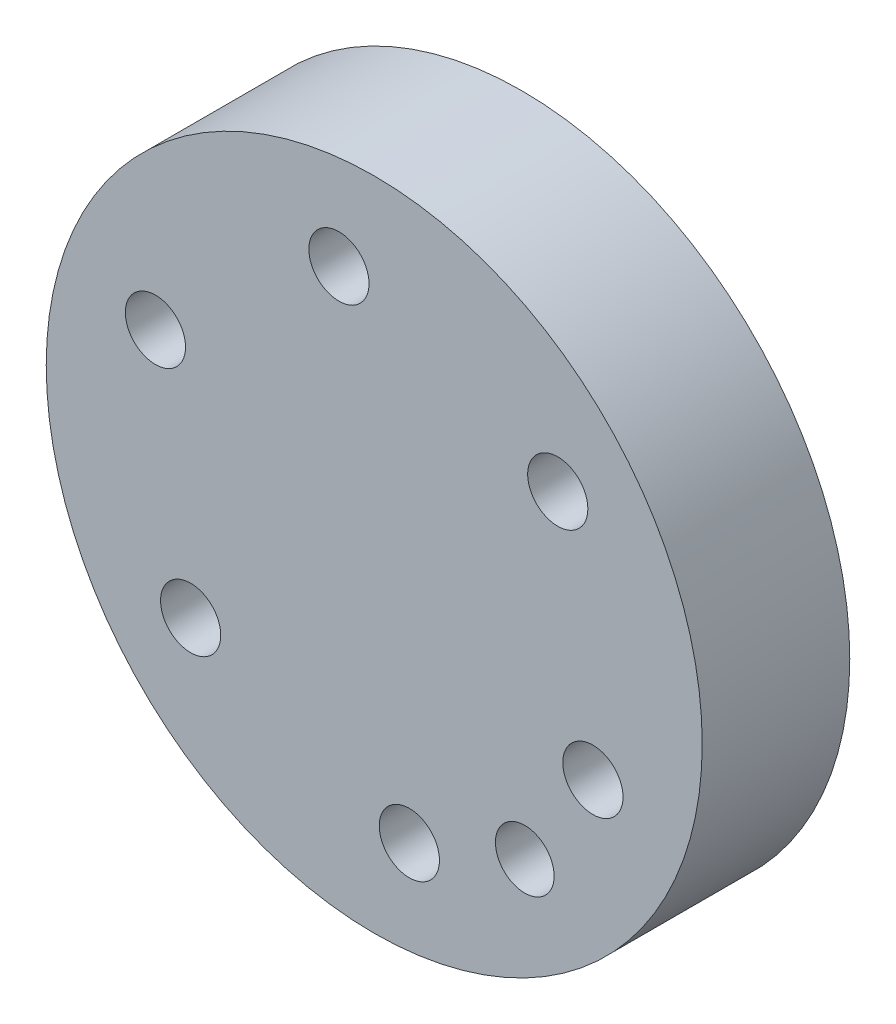
ISO-10303-21;
HEADER;
FILE_DESCRIPTION(('STEP AP214'),'2;1');
FILE_NAME('part.step','',(''),(''),'','','');
FILE_SCHEMA(('AUTOMOTIVE_DESIGN { 1 0 10303 214 1 1 1 1 }'));
ENDSEC;
DATA;
#1=APPLICATION_CONTEXT('core data for automotive mechanical design processes');
#2=APPLICATION_PROTOCOL_DEFINITION('international standard','automotive_design',2000,#1);
#3=PRODUCT_CONTEXT('',#1,'mechanical');
#4=PRODUCT('Part','Part','',(#3));
#5=PRODUCT_RELATED_PRODUCT_CATEGORY('part','',(#4));
#6=PRODUCT_DEFINITION_FORMATION('','',#4);
#7=PRODUCT_DEFINITION_CONTEXT('part definition',#1,'design');
#8=PRODUCT_DEFINITION('design','',#6,#7);
#9=PRODUCT_DEFINITION_SHAPE('','',#8);
#10=(LENGTH_UNIT() NAMED_UNIT(*) SI_UNIT(.MILLI.,.METRE.));
#11=(NAMED_UNIT(*) PLANE_ANGLE_UNIT() SI_UNIT($,.RADIAN.));
#12=(NAMED_UNIT(*) SI_UNIT($,.STERADIAN.) SOLID_ANGLE_UNIT());
#13=UNCERTAINTY_MEASURE_WITH_UNIT(LENGTH_MEASURE(1.E-05),#10,'distance_accuracy_value','');
#14=(GEOMETRIC_REPRESENTATION_CONTEXT(3) GLOBAL_UNCERTAINTY_ASSIGNED_CONTEXT((#13)) GLOBAL_UNIT_ASSIGNED_CONTEXT((#10,
#11,#12)) REPRESENTATION_CONTEXT('',''));
#15=CARTESIAN_POINT('',(0.,0.,0.));
#16=DIRECTION('',(0.,0.,1.));
#17=DIRECTION('',(1.,0.,0.));
#18=AXIS2_PLACEMENT_3D('',#15,#16,#17);
#19=CARTESIAN_POINT('',(22.3808308558776,278.150413141266,0.));
#20=DIRECTION('',(0.,0.,-1.));
#21=DIRECTION('',(-1.,0.,0.));
#22=AXIS2_PLACEMENT_3D('',#19,#20,#21);
#23=PLANE('',#22);
#24=CARTESIAN_POINT('',(22.3808308558776,278.150413141266,0.));
#25=DIRECTION('',(0.,0.,-1.));
#26=DIRECTION('',(-1.,0.,0.));
#27=AXIS2_PLACEMENT_3D('',#24,#25,#26);
#28=CIRCLE('',#27,76.8000000000001);
#29=CARTESIAN_POINT('',(-54.4191691441225,278.150413141266,0.));
#30=VERTEX_POINT('',#29);
#31=EDGE_CURVE('E83',#30,#30,#28,.T.);
#32=ORIENTED_EDGE('',*,*,#31,.F.);
#33=EDGE_LOOP('',(#32));
#34=FACE_BOUND('',#33,.T.);
#35=CARTESIAN_POINT('',(-27.2647840173544,238.487003794824,0.));
#36=DIRECTION('',(0.,0.,-1.));
#37=DIRECTION('',(-1.,0.,0.));
#38=AXIS2_PLACEMENT_3D('',#35,#36,#37);
#39=CIRCLE('',#38,8.1375);
#40=CARTESIAN_POINT('',(-35.4022840173544,238.487003794824,0.));
#41=VERTEX_POINT('',#40);
#42=EDGE_CURVE('E93',#41,#41,#39,.T.);
#43=ORIENTED_EDGE('',*,*,#42,.T.);
#44=EDGE_LOOP('',(#43));
#45=FACE_BOUND('',#44,.T.);
#46=CARTESIAN_POINT('',(31.880563492685,215.334967411074,0.));
#47=DIRECTION('',(0.,0.,-1.));
#48=DIRECTION('',(-1.,0.,0.));
#49=AXIS2_PLACEMENT_3D('',#46,#47,#48);
#50=CIRCLE('',#49,8.13749999999999);
#51=CARTESIAN_POINT('',(23.743063492685,215.334967411074,0.));
#52=VERTEX_POINT('',#51);
#53=EDGE_CURVE('E96',#52,#52,#50,.T.);
#54=ORIENTED_EDGE('',*,*,#53,.T.);
#55=EDGE_LOOP('',(#54));
#56=FACE_BOUND('',#55,.T.);
#57=CARTESIAN_POINT('',(63.0883701991658,227.165480073372,0.));
#58=DIRECTION('',(0.,0.,-1.));
#59=DIRECTION('',(-1.,0.,0.));
#60=AXIS2_PLACEMENT_3D('',#57,#58,#59);
#61=CIRCLE('',#60,7.9375);
#62=CARTESIAN_POINT('',(55.1508701991658,227.165480073372,0.));
#63=VERTEX_POINT('',#62);
#64=EDGE_CURVE('E99',#63,#63,#61,.T.);
#65=ORIENTED_EDGE('',*,*,#64,.T.);
#66=EDGE_LOOP('',(#65));
#67=FACE_BOUND('',#66,.T.);
#68=CARTESIAN_POINT('',(81.5193470873584,254.971228105767,0.));
#69=DIRECTION('',(0.,0.,-1.));
#70=DIRECTION('',(-1.,0.,0.));
#71=AXIS2_PLACEMENT_3D('',#68,#69,#70);
#72=CIRCLE('',#71,8.13749999999999);
#73=CARTESIAN_POINT('',(73.3818470873584,254.971228105767,0.));
#74=VERTEX_POINT('',#73);
#75=EDGE_CURVE('E102',#74,#74,#72,.T.);
#76=ORIENTED_EDGE('',*,*,#75,.T.);
#77=EDGE_LOOP('',(#76));
#78=FACE_BOUND('',#77,.T.);
#79=CARTESIAN_POINT('',(-36.7846201529286,301.218051089699,0.));
#80=DIRECTION('',(0.,0.,-1.));
#81=DIRECTION('',(-1.,0.,0.));
#82=AXIS2_PLACEMENT_3D('',#79,#80,#81);
#83=CIRCLE('',#82,8.13750000000001);
#84=CARTESIAN_POINT('',(-44.9221201529286,301.218051089699,0.));
#85=VERTEX_POINT('',#84);
#86=EDGE_CURVE('E105',#85,#85,#83,.T.);
#87=ORIENTED_EDGE('',*,*,#86,.T.);
#88=EDGE_LOOP('',(#87));
#89=FACE_BOUND('',#88,.T.);
#90=CARTESIAN_POINT('',(12.834949907145,340.867975838614,0.));
#91=DIRECTION('',(0.,0.,-1.));
#92=DIRECTION('',(-1.,0.,0.));
#93=AXIS2_PLACEMENT_3D('',#90,#91,#92);
#94=CIRCLE('',#93,8.13750000000002);
#95=CARTESIAN_POINT('',(4.69744990714503,340.867975838614,0.));
#96=VERTEX_POINT('',#95);
#97=EDGE_CURVE('E108',#96,#96,#94,.T.);
#98=ORIENTED_EDGE('',*,*,#97,.T.);
#99=EDGE_LOOP('',(#98));
#100=FACE_BOUND('',#99,.T.);
#101=CARTESIAN_POINT('',(72.0102436325622,317.734321350223,0.));
#102=DIRECTION('',(0.,0.,-1.));
#103=DIRECTION('',(-1.,0.,0.));
#104=AXIS2_PLACEMENT_3D('',#101,#102,#103);
#105=CIRCLE('',#104,8.13749999999999);
#106=CARTESIAN_POINT('',(63.8727436325622,317.734321350223,0.));
#107=VERTEX_POINT('',#106);
#108=EDGE_CURVE('E91',#107,#107,#105,.T.);
#109=ORIENTED_EDGE('',*,*,#108,.T.);
#110=EDGE_LOOP('',(#109));
#111=FACE_BOUND('',#110,.T.);
#112=ADVANCED_FACE('F52',(#34,#45,#56,#67,#78,#89,#100,#111),#23,.F.);
#113=CARTESIAN_POINT('',(22.3808308558776,278.150413141266,-242.123203180508));
#114=DIRECTION('',(0.,0.,1.));
#115=DIRECTION('',(1.,0.,0.));
#116=AXIS2_PLACEMENT_3D('',#113,#114,#115);
#117=CYLINDRICAL_SURFACE('',#116,76.8000000000001);
#118=CARTESIAN_POINT('',(22.3808308558776,278.150413141266,-16.3));
#119=DIRECTION('',(0.,0.,1.));
#120=DIRECTION('',(1.,0.,0.));
#121=AXIS2_PLACEMENT_3D('',#118,#119,#120);
#122=CIRCLE('',#121,76.8000000000001);
#123=CARTESIAN_POINT('',(99.1808308558778,278.150413141266,-16.3));
#124=VERTEX_POINT('',#123);
#125=EDGE_CURVE('E68',#124,#124,#122,.T.);
#126=ORIENTED_EDGE('',*,*,#125,.T.);
#127=EDGE_LOOP('',(#126));
#128=FACE_BOUND('',#127,.T.);
#129=ORIENTED_EDGE('',*,*,#31,.T.);
#130=EDGE_LOOP('',(#129));
#131=FACE_BOUND('',#130,.T.);
#132=ADVANCED_FACE('F126',(#128,#131),#117,.T.);
#133=CARTESIAN_POINT('',(-27.2647840173544,238.487003794824,-242.123203180508));
#134=DIRECTION('',(0.,0.,1.));
#135=DIRECTION('',(1.,0.,0.));
#136=AXIS2_PLACEMENT_3D('',#133,#134,#135);
#137=CYLINDRICAL_SURFACE('',#136,8.1375);
#138=CARTESIAN_POINT('',(-27.2647840173544,238.487003794824,-16.3));
#139=DIRECTION('',(0.,0.,1.));
#140=DIRECTION('',(1.,0.,0.));
#141=AXIS2_PLACEMENT_3D('',#138,#139,#140);
#142=CIRCLE('',#141,8.1375);
#143=CARTESIAN_POINT('',(-19.1272840173544,238.487003794824,-16.3));
#144=VERTEX_POINT('',#143);
#145=EDGE_CURVE('E11',#144,#144,#142,.T.);
#146=ORIENTED_EDGE('',*,*,#145,.F.);
#147=EDGE_LOOP('',(#146));
#148=FACE_BOUND('',#147,.T.);
#149=ORIENTED_EDGE('',*,*,#42,.F.);
#150=EDGE_LOOP('',(#149));
#151=FACE_BOUND('',#150,.T.);
#152=ADVANCED_FACE('F132',(#148,#151),#137,.F.);
#153=CARTESIAN_POINT('',(31.880563492685,215.334967411074,-242.123203180508));
#154=DIRECTION('',(0.,0.,1.));
#155=DIRECTION('',(1.,0.,0.));
#156=AXIS2_PLACEMENT_3D('',#153,#154,#155);
#157=CYLINDRICAL_SURFACE('',#156,8.13749999999999);
#158=CARTESIAN_POINT('',(31.880563492685,215.334967411074,-16.3));
#159=DIRECTION('',(0.,0.,1.));
#160=DIRECTION('',(1.,0.,0.));
#161=AXIS2_PLACEMENT_3D('',#158,#159,#160);
#162=CIRCLE('',#161,8.13749999999999);
#163=CARTESIAN_POINT('',(40.018063492685,215.334967411074,-16.3));
#164=VERTEX_POINT('',#163);
#165=EDGE_CURVE('E60',#164,#164,#162,.T.);
#166=ORIENTED_EDGE('',*,*,#165,.F.);
#167=EDGE_LOOP('',(#166));
#168=FACE_BOUND('',#167,.T.);
#169=ORIENTED_EDGE('',*,*,#53,.F.);
#170=EDGE_LOOP('',(#169));
#171=FACE_BOUND('',#170,.T.);
#172=ADVANCED_FACE('F144',(#168,#171),#157,.F.);
#173=CARTESIAN_POINT('',(63.0883701991658,227.165480073372,-242.123203180508));
#174=DIRECTION('',(0.,0.,1.));
#175=DIRECTION('',(1.,0.,0.));
#176=AXIS2_PLACEMENT_3D('',#173,#174,#175);
#177=CYLINDRICAL_SURFACE('',#176,7.9375);
#178=CARTESIAN_POINT('',(63.0883701991658,227.165480073372,-16.3));
#179=DIRECTION('',(0.,0.,1.));
#180=DIRECTION('',(1.,0.,0.));
#181=AXIS2_PLACEMENT_3D('',#178,#179,#180);
#182=CIRCLE('',#181,7.9375);
#183=CARTESIAN_POINT('',(71.0258701991658,227.165480073372,-16.3));
#184=VERTEX_POINT('',#183);
#185=EDGE_CURVE('E65',#184,#184,#182,.T.);
#186=ORIENTED_EDGE('',*,*,#185,.F.);
#187=EDGE_LOOP('',(#186));
#188=FACE_BOUND('',#187,.T.);
#189=ORIENTED_EDGE('',*,*,#64,.F.);
#190=EDGE_LOOP('',(#189));
#191=FACE_BOUND('',#190,.T.);
#192=ADVANCED_FACE('F141',(#188,#191),#177,.F.);
#193=CARTESIAN_POINT('',(81.5193470873584,254.971228105767,-242.123203180508));
#194=DIRECTION('',(0.,0.,1.));
#195=DIRECTION('',(1.,0.,0.));
#196=AXIS2_PLACEMENT_3D('',#193,#194,#195);
#197=CYLINDRICAL_SURFACE('',#196,8.13749999999999);
#198=CARTESIAN_POINT('',(81.5193470873584,254.971228105767,-16.3));
#199=DIRECTION('',(0.,0.,1.));
#200=DIRECTION('',(1.,0.,0.));
#201=AXIS2_PLACEMENT_3D('',#198,#199,#200);
#202=CIRCLE('',#201,8.13749999999999);
#203=CARTESIAN_POINT('',(89.6568470873584,254.971228105767,-16.3));
#204=VERTEX_POINT('',#203);
#205=EDGE_CURVE('E73',#204,#204,#202,.T.);
#206=ORIENTED_EDGE('',*,*,#205,.F.);
#207=EDGE_LOOP('',(#206));
#208=FACE_BOUND('',#207,.T.);
#209=ORIENTED_EDGE('',*,*,#75,.F.);
#210=EDGE_LOOP('',(#209));
#211=FACE_BOUND('',#210,.T.);
#212=ADVANCED_FACE('F139',(#208,#211),#197,.F.);
#213=CARTESIAN_POINT('',(-36.7846201529286,301.218051089699,-242.123203180508));
#214=DIRECTION('',(0.,0.,1.));
#215=DIRECTION('',(1.,0.,0.));
#216=AXIS2_PLACEMENT_3D('',#213,#214,#215);
#217=CYLINDRICAL_SURFACE('',#216,8.13750000000001);
#218=CARTESIAN_POINT('',(-36.7846201529286,301.218051089699,-16.3));
#219=DIRECTION('',(0.,0.,1.));
#220=DIRECTION('',(1.,0.,0.));
#221=AXIS2_PLACEMENT_3D('',#218,#219,#220);
#222=CIRCLE('',#221,8.13750000000001);
#223=CARTESIAN_POINT('',(-28.6471201529286,301.218051089699,-16.3));
#224=VERTEX_POINT('',#223);
#225=EDGE_CURVE('E76',#224,#224,#222,.T.);
#226=ORIENTED_EDGE('',*,*,#225,.F.);
#227=EDGE_LOOP('',(#226));
#228=FACE_BOUND('',#227,.T.);
#229=ORIENTED_EDGE('',*,*,#86,.F.);
#230=EDGE_LOOP('',(#229));
#231=FACE_BOUND('',#230,.T.);
#232=ADVANCED_FACE('F122',(#228,#231),#217,.F.);
#233=CARTESIAN_POINT('',(12.834949907145,340.867975838614,-242.123203180508));
#234=DIRECTION('',(0.,0.,1.));
#235=DIRECTION('',(1.,0.,0.));
#236=AXIS2_PLACEMENT_3D('',#233,#234,#235);
#237=CYLINDRICAL_SURFACE('',#236,8.13750000000002);
#238=CARTESIAN_POINT('',(12.834949907145,340.867975838614,-16.3));
#239=DIRECTION('',(0.,0.,1.));
#240=DIRECTION('',(1.,0.,0.));
#241=AXIS2_PLACEMENT_3D('',#238,#239,#240);
#242=CIRCLE('',#241,8.13750000000002);
#243=CARTESIAN_POINT('',(20.9724499071451,340.867975838614,-16.3));
#244=VERTEX_POINT('',#243);
#245=EDGE_CURVE('E78',#244,#244,#242,.T.);
#246=ORIENTED_EDGE('',*,*,#245,.F.);
#247=EDGE_LOOP('',(#246));
#248=FACE_BOUND('',#247,.T.);
#249=ORIENTED_EDGE('',*,*,#97,.F.);
#250=EDGE_LOOP('',(#249));
#251=FACE_BOUND('',#250,.T.);
#252=ADVANCED_FACE('F116',(#248,#251),#237,.F.);
#253=CARTESIAN_POINT('',(72.0102436325622,317.734321350223,-242.123203180508));
#254=DIRECTION('',(0.,0.,1.));
#255=DIRECTION('',(1.,0.,0.));
#256=AXIS2_PLACEMENT_3D('',#253,#254,#255);
#257=CYLINDRICAL_SURFACE('',#256,8.13749999999999);
#258=CARTESIAN_POINT('',(72.0102436325622,317.734321350223,-16.3));
#259=DIRECTION('',(0.,0.,1.));
#260=DIRECTION('',(1.,0.,0.));
#261=AXIS2_PLACEMENT_3D('',#258,#259,#260);
#262=CIRCLE('',#261,8.13749999999999);
#263=CARTESIAN_POINT('',(80.1477436325622,317.734321350223,-16.3));
#264=VERTEX_POINT('',#263);
#265=EDGE_CURVE('E56',#264,#264,#262,.T.);
#266=ORIENTED_EDGE('',*,*,#265,.F.);
#267=EDGE_LOOP('',(#266));
#268=FACE_BOUND('',#267,.T.);
#269=ORIENTED_EDGE('',*,*,#108,.F.);
#270=EDGE_LOOP('',(#269));
#271=FACE_BOUND('',#270,.T.);
#272=ADVANCED_FACE('F114',(#268,#271),#257,.F.);
#273=CARTESIAN_POINT('',(22.3808308558776,278.150413141266,-16.3));
#274=DIRECTION('',(0.,0.,1.));
#275=DIRECTION('',(1.,0.,0.));
#276=AXIS2_PLACEMENT_3D('',#273,#274,#275);
#277=PLANE('',#276);
#278=ORIENTED_EDGE('',*,*,#265,.T.);
#279=EDGE_LOOP('',(#278));
#280=FACE_BOUND('',#279,.T.);
#281=ORIENTED_EDGE('',*,*,#245,.T.);
#282=EDGE_LOOP('',(#281));
#283=FACE_BOUND('',#282,.T.);
#284=ORIENTED_EDGE('',*,*,#225,.T.);
#285=EDGE_LOOP('',(#284));
#286=FACE_BOUND('',#285,.T.);
#287=ORIENTED_EDGE('',*,*,#205,.T.);
#288=EDGE_LOOP('',(#287));
#289=FACE_BOUND('',#288,.T.);
#290=ORIENTED_EDGE('',*,*,#185,.T.);
#291=EDGE_LOOP('',(#290));
#292=FACE_BOUND('',#291,.T.);
#293=ORIENTED_EDGE('',*,*,#165,.T.);
#294=EDGE_LOOP('',(#293));
#295=FACE_BOUND('',#294,.T.);
#296=ORIENTED_EDGE('',*,*,#145,.T.);
#297=EDGE_LOOP('',(#296));
#298=FACE_BOUND('',#297,.T.);
#299=ORIENTED_EDGE('',*,*,#125,.F.);
#300=EDGE_LOOP('',(#299));
#301=FACE_BOUND('',#300,.T.);
#302=ADVANCED_FACE('F54',(#280,#283,#286,#289,#292,#295,#298,#301),#277,.F.);
#303=CLOSED_SHELL('',(#112,#132,#152,#172,#192,#212,#232,#252,#272,#302));
#304=MANIFOLD_SOLID_BREP('B2',#303);
#305=CARTESIAN_POINT('',(22.3808308558776,278.150413141266,-24.9));
#306=DIRECTION('',(0.,0.,1.));
#307=DIRECTION('',(1.,0.,0.));
#308=AXIS2_PLACEMENT_3D('',#305,#306,#307);
#309=CYLINDRICAL_SURFACE('',#308,88.7);
#310=CARTESIAN_POINT('',(22.3808308558776,278.150413141266,-24.9));
#311=DIRECTION('',(0.,0.,1.));
#312=DIRECTION('',(1.,0.,0.));
#313=AXIS2_PLACEMENT_3D('',#310,#311,#312);
#314=CIRCLE('',#313,88.7);
#315=CARTESIAN_POINT('',(111.080830855878,278.150413141266,-24.9));
#316=VERTEX_POINT('',#315);
#317=EDGE_CURVE('E266',#316,#316,#314,.T.);
#318=ORIENTED_EDGE('',*,*,#317,.T.);
#319=EDGE_LOOP('',(#318));
#320=FACE_BOUND('',#319,.T.);
#321=CARTESIAN_POINT('',(22.3808308558776,278.150413141266,15.));
#322=DIRECTION('',(0.,0.,1.));
#323=DIRECTION('',(1.,0.,0.));
#324=AXIS2_PLACEMENT_3D('',#321,#322,#323);
#325=CIRCLE('',#324,88.7);
#326=CARTESIAN_POINT('',(111.080830855878,278.150413141266,15.));
#327=VERTEX_POINT('',#326);
#328=EDGE_CURVE('E272',#327,#327,#325,.T.);
#329=ORIENTED_EDGE('',*,*,#328,.F.);
#330=EDGE_LOOP('',(#329));
#331=FACE_BOUND('',#330,.T.);
#332=ADVANCED_FACE('F240',(#320,#331),#309,.T.);
#333=CARTESIAN_POINT('',(22.3808308558776,278.150413141266,-24.9));
#334=DIRECTION('',(0.,0.,1.));
#335=DIRECTION('',(1.,0.,0.));
#336=AXIS2_PLACEMENT_3D('',#333,#334,#335);
#337=PLANE('',#336);
#338=CARTESIAN_POINT('',(22.3808308558776,278.150413141266,-24.9));
#339=DIRECTION('',(0.,0.,1.));
#340=DIRECTION('',(1.,0.,0.));
#341=AXIS2_PLACEMENT_3D('',#338,#339,#340);
#342=CIRCLE('',#341,82.0696949688359);
#343=CARTESIAN_POINT('',(104.450525824714,278.150413141266,-24.9));
#344=VERTEX_POINT('',#343);
#345=EDGE_CURVE('E247',#344,#344,#342,.T.);
#346=ORIENTED_EDGE('',*,*,#345,.T.);
#347=EDGE_LOOP('',(#346));
#348=FACE_BOUND('',#347,.T.);
#349=ORIENTED_EDGE('',*,*,#317,.F.);
#350=EDGE_LOOP('',(#349));
#351=FACE_BOUND('',#350,.T.);
#352=ADVANCED_FACE('F336',(#348,#351),#337,.F.);
#353=CARTESIAN_POINT('',(22.3808308558776,278.150413141266,-24.9));
#354=DIRECTION('',(0.,0.,1.));
#355=DIRECTION('',(1.,0.,0.));
#356=AXIS2_PLACEMENT_3D('',#353,#354,#355);
#357=CYLINDRICAL_SURFACE('',#356,76.4000000000001);
#358=CARTESIAN_POINT('',(22.3808308558776,278.150413141266,-16.1141467497713));
#359=DIRECTION('',(0.,0.,1.));
#360=DIRECTION('',(1.,0.,0.));
#361=AXIS2_PLACEMENT_3D('',#358,#359,#360);
#362=CIRCLE('',#361,76.4000000000001);
#363=CARTESIAN_POINT('',(98.7808308558778,278.150413141266,-16.1141467497713));
#364=VERTEX_POINT('',#363);
#365=EDGE_CURVE('E255',#364,#364,#362,.F.);
#366=ORIENTED_EDGE('',*,*,#365,.T.);
#367=EDGE_LOOP('',(#366));
#368=FACE_BOUND('',#367,.T.);
#369=CARTESIAN_POINT('',(22.3808308558776,278.150413141266,0.));
#370=DIRECTION('',(0.,0.,1.));
#371=DIRECTION('',(1.,0.,0.));
#372=AXIS2_PLACEMENT_3D('',#369,#370,#371);
#373=CIRCLE('',#372,76.4000000000001);
#374=CARTESIAN_POINT('',(98.7808308558778,278.150413141266,0.));
#375=VERTEX_POINT('',#374);
#376=EDGE_CURVE('E269',#375,#375,#373,.T.);
#377=ORIENTED_EDGE('',*,*,#376,.T.);
#378=EDGE_LOOP('',(#377));
#379=FACE_BOUND('',#378,.T.);
#380=ADVANCED_FACE('F331',(#368,#379),#357,.F.);
#381=CARTESIAN_POINT('',(22.3808308558776,278.150413141266,0.));
#382=DIRECTION('',(0.,0.,1.));
#383=DIRECTION('',(1.,0.,0.));
#384=AXIS2_PLACEMENT_3D('',#381,#382,#383);
#385=PLANE('',#384);
#386=CARTESIAN_POINT('',(63.0883701991658,227.165480073372,0.));
#387=DIRECTION('',(0.,0.,1.));
#388=DIRECTION('',(1.,0.,0.));
#389=AXIS2_PLACEMENT_3D('',#386,#387,#388);
#390=CIRCLE('',#389,9.93749999999999);
#391=CARTESIAN_POINT('',(73.0258701991658,227.165480073372,0.));
#392=VERTEX_POINT('',#391);
#393=EDGE_CURVE('E263',#392,#392,#390,.T.);
#394=ORIENTED_EDGE('',*,*,#393,.T.);
#395=EDGE_LOOP('',(#394));
#396=FACE_BOUND('',#395,.T.);
#397=CARTESIAN_POINT('',(81.5193470873584,254.971228105767,0.));
#398=DIRECTION('',(0.,0.,1.));
#399=DIRECTION('',(1.,0.,0.));
#400=AXIS2_PLACEMENT_3D('',#397,#398,#399);
#401=CIRCLE('',#400,8.13749999999999);
#402=CARTESIAN_POINT('',(89.6568470873584,254.971228105767,0.));
#403=VERTEX_POINT('',#402);
#404=EDGE_CURVE('E306',#403,#403,#401,.T.);
#405=ORIENTED_EDGE('',*,*,#404,.T.);
#406=EDGE_LOOP('',(#405));
#407=FACE_BOUND('',#406,.T.);
#408=CARTESIAN_POINT('',(31.880563492685,215.334967411074,0.));
#409=DIRECTION('',(0.,0.,1.));
#410=DIRECTION('',(1.,0.,0.));
#411=AXIS2_PLACEMENT_3D('',#408,#409,#410);
#412=CIRCLE('',#411,8.1375);
#413=CARTESIAN_POINT('',(40.018063492685,215.334967411074,0.));
#414=VERTEX_POINT('',#413);
#415=EDGE_CURVE('E300',#414,#414,#412,.T.);
#416=ORIENTED_EDGE('',*,*,#415,.T.);
#417=EDGE_LOOP('',(#416));
#418=FACE_BOUND('',#417,.T.);
#419=CARTESIAN_POINT('',(-27.2647840173544,238.487003794824,0.));
#420=DIRECTION('',(0.,0.,1.));
#421=DIRECTION('',(1.,0.,0.));
#422=AXIS2_PLACEMENT_3D('',#419,#420,#421);
#423=CIRCLE('',#422,8.1375);
#424=CARTESIAN_POINT('',(-19.1272840173544,238.487003794824,0.));
#425=VERTEX_POINT('',#424);
#426=EDGE_CURVE('E294',#425,#425,#423,.T.);
#427=ORIENTED_EDGE('',*,*,#426,.T.);
#428=EDGE_LOOP('',(#427));
#429=FACE_BOUND('',#428,.T.);
#430=CARTESIAN_POINT('',(-36.7846201529286,301.218051089699,0.));
#431=DIRECTION('',(0.,0.,1.));
#432=DIRECTION('',(1.,0.,0.));
#433=AXIS2_PLACEMENT_3D('',#430,#431,#432);
#434=CIRCLE('',#433,8.1375);
#435=CARTESIAN_POINT('',(-28.6471201529286,301.218051089699,0.));
#436=VERTEX_POINT('',#435);
#437=EDGE_CURVE('E288',#436,#436,#434,.T.);
#438=ORIENTED_EDGE('',*,*,#437,.T.);
#439=EDGE_LOOP('',(#438));
#440=FACE_BOUND('',#439,.T.);
#441=CARTESIAN_POINT('',(72.0102436325622,317.734321350223,0.));
#442=DIRECTION('',(0.,0.,1.));
#443=DIRECTION('',(1.,0.,0.));
#444=AXIS2_PLACEMENT_3D('',#441,#442,#443);
#445=CIRCLE('',#444,8.13749999999999);
#446=CARTESIAN_POINT('',(80.1477436325622,317.734321350223,0.));
#447=VERTEX_POINT('',#446);
#448=EDGE_CURVE('E282',#447,#447,#445,.T.);
#449=ORIENTED_EDGE('',*,*,#448,.T.);
#450=EDGE_LOOP('',(#449));
#451=FACE_BOUND('',#450,.T.);
#452=CARTESIAN_POINT('',(12.834949907145,340.867975838614,0.));
#453=DIRECTION('',(0.,0.,1.));
#454=DIRECTION('',(1.,0.,0.));
#455=AXIS2_PLACEMENT_3D('',#452,#453,#454);
#456=CIRCLE('',#455,8.13750000000001);
#457=CARTESIAN_POINT('',(20.9724499071451,340.867975838614,0.));
#458=VERTEX_POINT('',#457);
#459=EDGE_CURVE('E276',#458,#458,#456,.T.);
#460=ORIENTED_EDGE('',*,*,#459,.T.);
#461=EDGE_LOOP('',(#460));
#462=FACE_BOUND('',#461,.T.);
#463=ORIENTED_EDGE('',*,*,#376,.F.);
#464=EDGE_LOOP('',(#463));
#465=FACE_BOUND('',#464,.T.);
#466=ADVANCED_FACE('F320',(#396,#407,#418,#429,#440,#451,#462,#465),#385,.F.);
#467=CARTESIAN_POINT('',(22.3808308558776,278.150413141266,15.));
#468=DIRECTION('',(0.,0.,1.));
#469=DIRECTION('',(1.,0.,0.));
#470=AXIS2_PLACEMENT_3D('',#467,#468,#469);
#471=PLANE('',#470);
#472=CARTESIAN_POINT('',(81.5193470873584,254.971228105767,15.));
#473=DIRECTION('',(0.,0.,1.));
#474=DIRECTION('',(1.,0.,0.));
#475=AXIS2_PLACEMENT_3D('',#472,#473,#474);
#476=CIRCLE('',#475,8.13749999999999);
#477=CARTESIAN_POINT('',(89.6568470873584,254.971228105767,15.));
#478=VERTEX_POINT('',#477);
#479=EDGE_CURVE('E303',#478,#478,#476,.T.);
#480=ORIENTED_EDGE('',*,*,#479,.F.);
#481=EDGE_LOOP('',(#480));
#482=FACE_BOUND('',#481,.T.);
#483=CARTESIAN_POINT('',(-27.2647840173544,238.487003794824,15.));
#484=DIRECTION('',(0.,0.,1.));
#485=DIRECTION('',(1.,0.,0.));
#486=AXIS2_PLACEMENT_3D('',#483,#484,#485);
#487=CIRCLE('',#486,8.1375);
#488=CARTESIAN_POINT('',(-19.1272840173544,238.487003794824,15.));
#489=VERTEX_POINT('',#488);
#490=EDGE_CURVE('E291',#489,#489,#487,.T.);
#491=ORIENTED_EDGE('',*,*,#490,.F.);
#492=EDGE_LOOP('',(#491));
#493=FACE_BOUND('',#492,.T.);
#494=CARTESIAN_POINT('',(72.0102436325622,317.734321350223,15.));
#495=DIRECTION('',(0.,0.,1.));
#496=DIRECTION('',(1.,0.,0.));
#497=AXIS2_PLACEMENT_3D('',#494,#495,#496);
#498=CIRCLE('',#497,8.13749999999999);
#499=CARTESIAN_POINT('',(80.1477436325622,317.734321350223,15.));
#500=VERTEX_POINT('',#499);
#501=EDGE_CURVE('E279',#500,#500,#498,.T.);
#502=ORIENTED_EDGE('',*,*,#501,.F.);
#503=EDGE_LOOP('',(#502));
#504=FACE_BOUND('',#503,.T.);
#505=ORIENTED_EDGE('',*,*,#328,.T.);
#506=EDGE_LOOP('',(#505));
#507=FACE_BOUND('',#506,.T.);
#508=CARTESIAN_POINT('',(12.834949907145,340.867975838614,15.));
#509=DIRECTION('',(0.,0.,1.));
#510=DIRECTION('',(1.,0.,0.));
#511=AXIS2_PLACEMENT_3D('',#508,#509,#510);
#512=CIRCLE('',#511,8.13750000000001);
#513=CARTESIAN_POINT('',(20.9724499071451,340.867975838614,15.));
#514=VERTEX_POINT('',#513);
#515=EDGE_CURVE('E275',#514,#514,#512,.T.);
#516=ORIENTED_EDGE('',*,*,#515,.F.);
#517=EDGE_LOOP('',(#516));
#518=FACE_BOUND('',#517,.T.);
#519=CARTESIAN_POINT('',(-36.7846201529286,301.218051089699,15.));
#520=DIRECTION('',(0.,0.,1.));
#521=DIRECTION('',(1.,0.,0.));
#522=AXIS2_PLACEMENT_3D('',#519,#520,#521);
#523=CIRCLE('',#522,8.1375);
#524=CARTESIAN_POINT('',(-28.6471201529286,301.218051089699,15.));
#525=VERTEX_POINT('',#524);
#526=EDGE_CURVE('E285',#525,#525,#523,.T.);
#527=ORIENTED_EDGE('',*,*,#526,.F.);
#528=EDGE_LOOP('',(#527));
#529=FACE_BOUND('',#528,.T.);
#530=CARTESIAN_POINT('',(31.880563492685,215.334967411074,15.));
#531=DIRECTION('',(0.,0.,1.));
#532=DIRECTION('',(1.,0.,0.));
#533=AXIS2_PLACEMENT_3D('',#530,#531,#532);
#534=CIRCLE('',#533,8.1375);
#535=CARTESIAN_POINT('',(40.018063492685,215.334967411074,15.));
#536=VERTEX_POINT('',#535);
#537=EDGE_CURVE('E297',#536,#536,#534,.T.);
#538=ORIENTED_EDGE('',*,*,#537,.F.);
#539=EDGE_LOOP('',(#538));
#540=FACE_BOUND('',#539,.T.);
#541=CARTESIAN_POINT('',(63.0883701991658,227.165480073372,15.));
#542=DIRECTION('',(0.,0.,1.));
#543=DIRECTION('',(1.,0.,0.));
#544=AXIS2_PLACEMENT_3D('',#541,#542,#543);
#545=CIRCLE('',#544,7.93749999999999);
#546=CARTESIAN_POINT('',(71.0258701991658,227.165480073372,15.));
#547=VERTEX_POINT('',#546);
#548=EDGE_CURVE('E309',#547,#547,#545,.T.);
#549=ORIENTED_EDGE('',*,*,#548,.F.);
#550=EDGE_LOOP('',(#549));
#551=FACE_BOUND('',#550,.T.);
#552=ADVANCED_FACE('F317',(#482,#493,#504,#507,#518,#529,#540,#551),#471,.T.);
#553=CARTESIAN_POINT('',(12.834949907145,340.867975838614,15.));
#554=DIRECTION('',(0.,0.,-1.));
#555=DIRECTION('',(-1.,0.,0.));
#556=AXIS2_PLACEMENT_3D('',#553,#554,#555);
#557=CYLINDRICAL_SURFACE('',#556,8.13750000000001);
#558=ORIENTED_EDGE('',*,*,#515,.T.);
#559=EDGE_LOOP('',(#558));
#560=FACE_BOUND('',#559,.T.);
#561=ORIENTED_EDGE('',*,*,#459,.F.);
#562=EDGE_LOOP('',(#561));
#563=FACE_BOUND('',#562,.T.);
#564=ADVANCED_FACE('F319',(#560,#563),#557,.F.);
#565=CARTESIAN_POINT('',(72.0102436325622,317.734321350223,15.));
#566=DIRECTION('',(0.,0.,-1.));
#567=DIRECTION('',(-1.,0.,0.));
#568=AXIS2_PLACEMENT_3D('',#565,#566,#567);
#569=CYLINDRICAL_SURFACE('',#568,8.13749999999999);
#570=ORIENTED_EDGE('',*,*,#501,.T.);
#571=EDGE_LOOP('',(#570));
#572=FACE_BOUND('',#571,.T.);
#573=ORIENTED_EDGE('',*,*,#448,.F.);
#574=EDGE_LOOP('',(#573));
#575=FACE_BOUND('',#574,.T.);
#576=ADVANCED_FACE('F327',(#572,#575),#569,.F.);
#577=CARTESIAN_POINT('',(-36.7846201529286,301.218051089699,15.));
#578=DIRECTION('',(0.,0.,-1.));
#579=DIRECTION('',(-1.,0.,0.));
#580=AXIS2_PLACEMENT_3D('',#577,#578,#579);
#581=CYLINDRICAL_SURFACE('',#580,8.1375);
#582=ORIENTED_EDGE('',*,*,#526,.T.);
#583=EDGE_LOOP('',(#582));
#584=FACE_BOUND('',#583,.T.);
#585=ORIENTED_EDGE('',*,*,#437,.F.);
#586=EDGE_LOOP('',(#585));
#587=FACE_BOUND('',#586,.T.);
#588=ADVANCED_FACE('F417',(#584,#587),#581,.F.);
#589=CARTESIAN_POINT('',(-27.2647840173544,238.487003794824,15.));
#590=DIRECTION('',(0.,0.,-1.));
#591=DIRECTION('',(-1.,0.,0.));
#592=AXIS2_PLACEMENT_3D('',#589,#590,#591);
#593=CYLINDRICAL_SURFACE('',#592,8.1375);
#594=ORIENTED_EDGE('',*,*,#490,.T.);
#595=EDGE_LOOP('',(#594));
#596=FACE_BOUND('',#595,.T.);
#597=ORIENTED_EDGE('',*,*,#426,.F.);
#598=EDGE_LOOP('',(#597));
#599=FACE_BOUND('',#598,.T.);
#600=ADVANCED_FACE('F408',(#596,#599),#593,.F.);
#601=CARTESIAN_POINT('',(31.880563492685,215.334967411074,15.));
#602=DIRECTION('',(0.,0.,-1.));
#603=DIRECTION('',(-1.,0.,0.));
#604=AXIS2_PLACEMENT_3D('',#601,#602,#603);
#605=CYLINDRICAL_SURFACE('',#604,8.1375);
#606=ORIENTED_EDGE('',*,*,#537,.T.);
#607=EDGE_LOOP('',(#606));
#608=FACE_BOUND('',#607,.T.);
#609=ORIENTED_EDGE('',*,*,#415,.F.);
#610=EDGE_LOOP('',(#609));
#611=FACE_BOUND('',#610,.T.);
#612=ADVANCED_FACE('F399',(#608,#611),#605,.F.);
#613=CARTESIAN_POINT('',(81.5193470873584,254.971228105767,15.));
#614=DIRECTION('',(0.,0.,-1.));
#615=DIRECTION('',(-1.,0.,0.));
#616=AXIS2_PLACEMENT_3D('',#613,#614,#615);
#617=CYLINDRICAL_SURFACE('',#616,8.13749999999999);
#618=ORIENTED_EDGE('',*,*,#479,.T.);
#619=EDGE_LOOP('',(#618));
#620=FACE_BOUND('',#619,.T.);
#621=ORIENTED_EDGE('',*,*,#404,.F.);
#622=EDGE_LOOP('',(#621));
#623=FACE_BOUND('',#622,.T.);
#624=ADVANCED_FACE('F384',(#620,#623),#617,.F.);
#625=CARTESIAN_POINT('',(63.0883701991658,227.165480073372,15.));
#626=DIRECTION('',(0.,0.,-1.));
#627=DIRECTION('',(-1.,0.,0.));
#628=AXIS2_PLACEMENT_3D('',#625,#626,#627);
#629=CYLINDRICAL_SURFACE('',#628,7.93749999999999);
#630=CARTESIAN_POINT('',(63.0883701991658,227.165480073372,2.));
#631=DIRECTION('',(0.,0.,1.));
#632=DIRECTION('',(1.,0.,0.));
#633=AXIS2_PLACEMENT_3D('',#630,#631,#632);
#634=CIRCLE('',#633,7.93749999999999);
#635=CARTESIAN_POINT('',(71.0258701991658,227.165480073372,2.));
#636=VERTEX_POINT('',#635);
#637=EDGE_CURVE('E260',#636,#636,#634,.F.);
#638=ORIENTED_EDGE('',*,*,#637,.T.);
#639=EDGE_LOOP('',(#638));
#640=FACE_BOUND('',#639,.T.);
#641=ORIENTED_EDGE('',*,*,#548,.T.);
#642=EDGE_LOOP('',(#641));
#643=FACE_BOUND('',#642,.T.);
#644=ADVANCED_FACE('F315',(#640,#643),#629,.F.);
#645=CARTESIAN_POINT('',(63.0883701991658,227.165480073372,2.));
#646=DIRECTION('',(0.,0.,1.));
#647=DIRECTION('',(1.,0.,0.));
#648=AXIS2_PLACEMENT_3D('',#645,#646,#647);
#649=TOROIDAL_SURFACE('',#648,9.93749999999999,2.);
#650=ORIENTED_EDGE('',*,*,#637,.F.);
#651=EDGE_LOOP('',(#650));
#652=FACE_BOUND('',#651,.T.);
#653=ORIENTED_EDGE('',*,*,#393,.F.);
#654=EDGE_LOOP('',(#653));
#655=FACE_BOUND('',#654,.T.);
#656=ADVANCED_FACE('F346',(#652,#655),#649,.T.);
#657=CARTESIAN_POINT('',(22.3808308558776,278.150413141266,-24.9));
#658=DIRECTION('',(0.,0.,-1.));
#659=DIRECTION('',(-1.,0.,0.));
#660=AXIS2_PLACEMENT_3D('',#657,#658,#659);
#661=CONICAL_SURFACE('',#660,80.9000000000001,0.512389460310735);
#662=CARTESIAN_POINT('',(22.3808308558776,278.150413141266,-23.8805224792651));
#663=DIRECTION('',(0.,0.,-1.));
#664=DIRECTION('',(-1.,0.,0.));
#665=AXIS2_PLACEMENT_3D('',#662,#663,#664);
#666=CIRCLE('',#665,80.3265438945868);
#667=CARTESIAN_POINT('',(-57.9457130387091,278.150413141266,-23.8805224792651));
#668=VERTEX_POINT('',#667);
#669=EDGE_CURVE('E51',#668,#668,#666,.T.);
#670=ORIENTED_EDGE('',*,*,#669,.T.);
#671=EDGE_LOOP('',(#670));
#672=FACE_BOUND('',#671,.T.);
#673=CARTESIAN_POINT('',(22.3808308558776,278.150413141266,-17.584930468669));
#674=DIRECTION('',(0.,0.,-1.));
#675=DIRECTION('',(-1.,0.,0.));
#676=AXIS2_PLACEMENT_3D('',#673,#674,#675);
#677=CIRCLE('',#676,76.7852733886265);
#678=CARTESIAN_POINT('',(-54.4044425327489,278.150413141266,-17.584930468669));
#679=VERTEX_POINT('',#678);
#680=EDGE_CURVE('E251',#679,#679,#677,.F.);
#681=ORIENTED_EDGE('',*,*,#680,.T.);
#682=EDGE_LOOP('',(#681));
#683=FACE_BOUND('',#682,.T.);
#684=ADVANCED_FACE('F349',(#672,#683),#661,.F.);
#685=CARTESIAN_POINT('',(22.3808308558776,278.150413141266,-16.1141467497713));
#686=DIRECTION('',(0.,0.,1.));
#687=DIRECTION('',(1.,0.,0.));
#688=AXIS2_PLACEMENT_3D('',#685,#686,#687);
#689=TOROIDAL_SURFACE('',#688,79.4000000000001,3.);
#690=ORIENTED_EDGE('',*,*,#680,.F.);
#691=EDGE_LOOP('',(#690));
#692=FACE_BOUND('',#691,.T.);
#693=ORIENTED_EDGE('',*,*,#365,.F.);
#694=EDGE_LOOP('',(#693));
#695=FACE_BOUND('',#694,.T.);
#696=ADVANCED_FACE('F355',(#692,#695),#689,.T.);
#697=CARTESIAN_POINT('',(22.3808308558776,278.150413141266,-22.9));
#698=DIRECTION('',(0.,0.,1.));
#699=DIRECTION('',(1.,0.,0.));
#700=AXIS2_PLACEMENT_3D('',#697,#698,#699);
#701=TOROIDAL_SURFACE('',#700,82.0696949688359,2.);
#702=ORIENTED_EDGE('',*,*,#669,.F.);
#703=EDGE_LOOP('',(#702));
#704=FACE_BOUND('',#703,.T.);
#705=ORIENTED_EDGE('',*,*,#345,.F.);
#706=EDGE_LOOP('',(#705));
#707=FACE_BOUND('',#706,.T.);
#708=ADVANCED_FACE('F242',(#704,#707),#701,.T.);
#709=CLOSED_SHELL('',(#332,#352,#380,#466,#552,#564,#576,#588,#600,#612,#624,#644,#656,#684,
#696,#708));
#710=MANIFOLD_SOLID_BREP('B6',#709);
#711=ADVANCED_BREP_SHAPE_REPRESENTATION('',(#18,#304,#710),#14);
#712=SHAPE_DEFINITION_REPRESENTATION(#9,#711);
ENDSEC;
END-ISO-10303-21;
